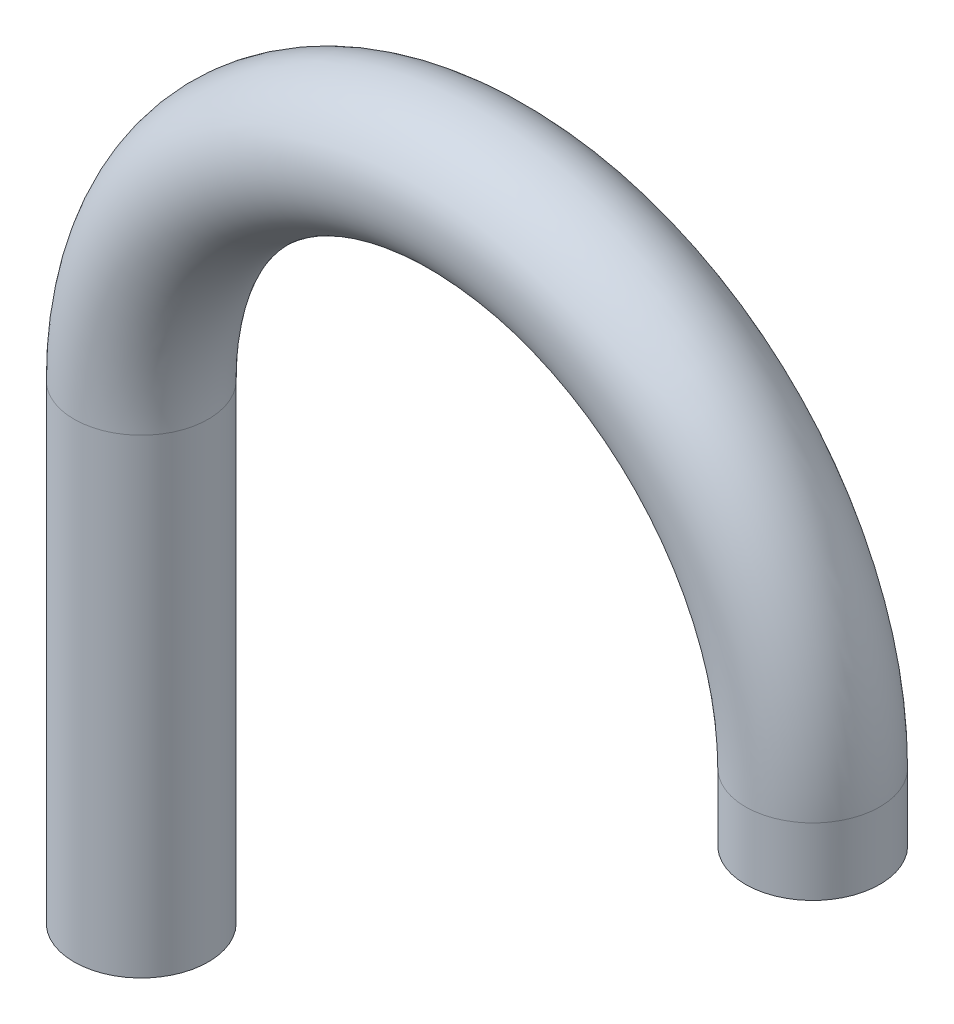
ISO-10303-21;
HEADER;
FILE_DESCRIPTION(('STEP AP214'),'2;1');
FILE_NAME('part.step','',(''),(''),'','','');
FILE_SCHEMA(('AUTOMOTIVE_DESIGN { 1 0 10303 214 1 1 1 1 }'));
ENDSEC;
DATA;
#1=APPLICATION_CONTEXT('core data for automotive mechanical design processes');
#2=APPLICATION_PROTOCOL_DEFINITION('international standard','automotive_design',2000,#1);
#3=PRODUCT_CONTEXT('',#1,'mechanical');
#4=PRODUCT('Part','Part','',(#3));
#5=PRODUCT_RELATED_PRODUCT_CATEGORY('part','',(#4));
#6=PRODUCT_DEFINITION_FORMATION('','',#4);
#7=PRODUCT_DEFINITION_CONTEXT('part definition',#1,'design');
#8=PRODUCT_DEFINITION('design','',#6,#7);
#9=PRODUCT_DEFINITION_SHAPE('','',#8);
#10=(LENGTH_UNIT() NAMED_UNIT(*) SI_UNIT(.MILLI.,.METRE.));
#11=(NAMED_UNIT(*) PLANE_ANGLE_UNIT() SI_UNIT($,.RADIAN.));
#12=(NAMED_UNIT(*) SI_UNIT($,.STERADIAN.) SOLID_ANGLE_UNIT());
#13=UNCERTAINTY_MEASURE_WITH_UNIT(LENGTH_MEASURE(1.E-05),#10,'distance_accuracy_value','');
#14=(GEOMETRIC_REPRESENTATION_CONTEXT(3) GLOBAL_UNCERTAINTY_ASSIGNED_CONTEXT((#13)) GLOBAL_UNIT_ASSIGNED_CONTEXT((#10,
#11,#12)) REPRESENTATION_CONTEXT('',''));
#15=CARTESIAN_POINT('',(0.,0.,0.));
#16=DIRECTION('',(0.,0.,1.));
#17=DIRECTION('',(1.,0.,0.));
#18=AXIS2_PLACEMENT_3D('',#15,#16,#17);
#19=CARTESIAN_POINT('',(5.,-1.,0.));
#20=DIRECTION('',(0.,-1.,0.));
#21=DIRECTION('',(0.,0.,1.));
#22=AXIS2_PLACEMENT_3D('',#19,#20,#21);
#23=PLANE('',#22);
#24=CARTESIAN_POINT('',(5.,-1.,0.));
#25=DIRECTION('',(0.,-1.,0.));
#26=DIRECTION('',(0.,0.,1.));
#27=AXIS2_PLACEMENT_3D('',#24,#25,#26);
#28=CIRCLE('',#27,1.);
#29=CARTESIAN_POINT('',(5.,-1.,1.));
#30=VERTEX_POINT('',#29);
#31=EDGE_CURVE('E44',#30,#30,#28,.T.);
#32=ORIENTED_EDGE('',*,*,#31,.T.);
#33=EDGE_LOOP('',(#32));
#34=FACE_BOUND('',#33,.T.);
#35=ADVANCED_FACE('F32',(#34),#23,.T.);
#36=CARTESIAN_POINT('',(-5.,-7.,0.));
#37=DIRECTION('',(0.,1.,0.));
#38=DIRECTION('',(0.,0.,1.));
#39=AXIS2_PLACEMENT_3D('',#36,#37,#38);
#40=PLANE('',#39);
#41=CARTESIAN_POINT('',(-5.,-7.,0.));
#42=DIRECTION('',(0.,1.,0.));
#43=DIRECTION('',(0.,0.,1.));
#44=AXIS2_PLACEMENT_3D('',#41,#42,#43);
#45=CIRCLE('',#44,1.);
#46=CARTESIAN_POINT('',(-5.,-7.,1.));
#47=VERTEX_POINT('',#46);
#48=EDGE_CURVE('E11',#47,#47,#45,.T.);
#49=ORIENTED_EDGE('',*,*,#48,.F.);
#50=EDGE_LOOP('',(#49));
#51=FACE_BOUND('',#50,.T.);
#52=ADVANCED_FACE('F50',(#51),#40,.F.);
#53=CARTESIAN_POINT('',(5.,-1.,0.));
#54=DIRECTION('',(0.,1.,0.));
#55=DIRECTION('',(0.,0.,1.));
#56=AXIS2_PLACEMENT_3D('',#53,#54,#55);
#57=CYLINDRICAL_SURFACE('',#56,1.);
#58=CARTESIAN_POINT('',(5.,0.,0.));
#59=DIRECTION('',(0.,-1.,0.));
#60=DIRECTION('',(0.,0.,1.));
#61=AXIS2_PLACEMENT_3D('',#58,#59,#60);
#62=CIRCLE('',#61,1.);
#63=CARTESIAN_POINT('',(6.,0.,0.));
#64=VERTEX_POINT('',#63);
#65=EDGE_CURVE('E75',#64,#64,#62,.T.);
#66=ORIENTED_EDGE('',*,*,#65,.T.);
#67=EDGE_LOOP('',(#66));
#68=FACE_BOUND('',#67,.T.);
#69=ORIENTED_EDGE('',*,*,#31,.F.);
#70=EDGE_LOOP('',(#69));
#71=FACE_BOUND('',#70,.T.);
#72=ADVANCED_FACE('F52',(#68,#71),#57,.T.);
#73=CARTESIAN_POINT('',(0.,0.,0.));
#74=DIRECTION('',(0.,0.,1.));
#75=DIRECTION('',(1.,0.,0.));
#76=AXIS2_PLACEMENT_3D('',#73,#74,#75);
#77=TOROIDAL_SURFACE('',#76,5.,1.);
#78=CARTESIAN_POINT('',(-5.,0.,0.));
#79=DIRECTION('',(0.,1.,0.));
#80=DIRECTION('',(0.,0.,1.));
#81=AXIS2_PLACEMENT_3D('',#78,#79,#80);
#82=CIRCLE('',#81,1.);
#83=CARTESIAN_POINT('',(-6.,0.,0.));
#84=VERTEX_POINT('',#83);
#85=EDGE_CURVE('E39',#84,#84,#82,.T.);
#86=CARTESIAN_POINT('',(0.,0.,0.));
#87=DIRECTION('',(0.,0.,1.));
#88=DIRECTION('',(1.,0.,0.));
#89=AXIS2_PLACEMENT_3D('',#86,#87,#88);
#90=CIRCLE('',#89,6.);
#91=EDGE_CURVE('',#64,#84,#90,.T.);
#92=ORIENTED_EDGE('',*,*,#65,.F.);
#93=ORIENTED_EDGE('',*,*,#85,.T.);
#94=ORIENTED_EDGE('',*,*,#91,.T.);
#95=ORIENTED_EDGE('',*,*,#91,.F.);
#96=EDGE_LOOP('',(#92,#94,#93,#95));
#97=FACE_BOUND('',#96,.T.);
#98=ADVANCED_FACE('F57',(#97),#77,.T.);
#99=CARTESIAN_POINT('',(-5.,0.,0.));
#100=DIRECTION('',(0.,-1.,0.));
#101=DIRECTION('',(1.,0.,0.));
#102=AXIS2_PLACEMENT_3D('',#99,#100,#101);
#103=CYLINDRICAL_SURFACE('',#102,1.);
#104=ORIENTED_EDGE('',*,*,#48,.T.);
#105=EDGE_LOOP('',(#104));
#106=FACE_BOUND('',#105,.T.);
#107=ORIENTED_EDGE('',*,*,#85,.F.);
#108=EDGE_LOOP('',(#107));
#109=FACE_BOUND('',#108,.T.);
#110=ADVANCED_FACE('F47',(#106,#109),#103,.T.);
#111=CLOSED_SHELL('',(#35,#52,#72,#98,#110));
#112=MANIFOLD_SOLID_BREP('B2',#111);
#113=ADVANCED_BREP_SHAPE_REPRESENTATION('',(#18,#112),#14);
#114=SHAPE_DEFINITION_REPRESENTATION(#9,#113);
ENDSEC;
END-ISO-10303-21;
